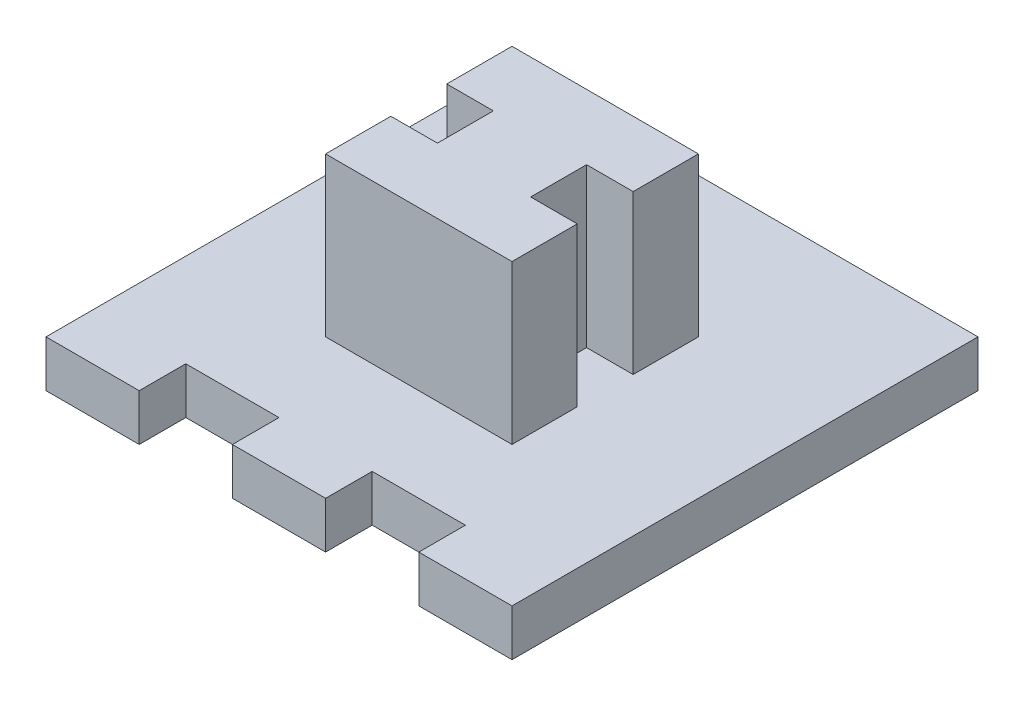
ISO-10303-21;
HEADER;
FILE_DESCRIPTION(('STEP AP214'),'2;1');
FILE_NAME('part.step','',(''),(''),'','','');
FILE_SCHEMA(('AUTOMOTIVE_DESIGN { 1 0 10303 214 1 1 1 1 }'));
ENDSEC;
DATA;
#1=APPLICATION_CONTEXT('core data for automotive mechanical design processes');
#2=APPLICATION_PROTOCOL_DEFINITION('international standard','automotive_design',2000,#1);
#3=PRODUCT_CONTEXT('',#1,'mechanical');
#4=PRODUCT('Part','Part','',(#3));
#5=PRODUCT_RELATED_PRODUCT_CATEGORY('part','',(#4));
#6=PRODUCT_DEFINITION_FORMATION('','',#4);
#7=PRODUCT_DEFINITION_CONTEXT('part definition',#1,'design');
#8=PRODUCT_DEFINITION('design','',#6,#7);
#9=PRODUCT_DEFINITION_SHAPE('','',#8);
#10=(LENGTH_UNIT() NAMED_UNIT(*) SI_UNIT(.MILLI.,.METRE.));
#11=(NAMED_UNIT(*) PLANE_ANGLE_UNIT() SI_UNIT($,.RADIAN.));
#12=(NAMED_UNIT(*) SI_UNIT($,.STERADIAN.) SOLID_ANGLE_UNIT());
#13=UNCERTAINTY_MEASURE_WITH_UNIT(LENGTH_MEASURE(1.E-05),#10,'distance_accuracy_value','');
#14=(GEOMETRIC_REPRESENTATION_CONTEXT(3) GLOBAL_UNCERTAINTY_ASSIGNED_CONTEXT((#13)) GLOBAL_UNIT_ASSIGNED_CONTEXT((#10,
#11,#12)) REPRESENTATION_CONTEXT('',''));
#15=CARTESIAN_POINT('',(0.,0.,0.));
#16=DIRECTION('',(0.,0.,1.));
#17=DIRECTION('',(1.,0.,0.));
#18=AXIS2_PLACEMENT_3D('',#15,#16,#17);
#19=CARTESIAN_POINT('',(-20.,44.,-20.));
#20=DIRECTION('',(1.,0.,0.));
#21=DIRECTION('',(0.,0.,-1.));
#22=AXIS2_PLACEMENT_3D('',#19,#20,#21);
#23=PLANE('',#22);
#24=DIRECTION('',(0.,0.,1.));
#25=VECTOR('',#24,1.);
#26=CARTESIAN_POINT('',(-20.,10.,-20.));
#27=LINE('',#26,#25);
#28=CARTESIAN_POINT('',(-20.,10.,-20.));
#29=VERTEX_POINT('',#28);
#30=CARTESIAN_POINT('',(-20.,10.,-6.));
#31=VERTEX_POINT('',#30);
#32=EDGE_CURVE('E218',#29,#31,#27,.T.);
#33=ORIENTED_EDGE('',*,*,#32,.T.);
#34=DIRECTION('',(0.,1.,0.));
#35=VECTOR('',#34,1.);
#36=CARTESIAN_POINT('',(-20.,10.,-6.));
#37=LINE('',#36,#35);
#38=CARTESIAN_POINT('',(-20.,44.,-6.));
#39=VERTEX_POINT('',#38);
#40=EDGE_CURVE('E390',#31,#39,#37,.T.);
#41=ORIENTED_EDGE('',*,*,#40,.T.);
#42=DIRECTION('',(0.,0.,1.));
#43=VECTOR('',#42,1.);
#44=CARTESIAN_POINT('',(-20.,44.,-20.));
#45=LINE('',#44,#43);
#46=CARTESIAN_POINT('',(-20.,44.,-20.));
#47=VERTEX_POINT('',#46);
#48=EDGE_CURVE('E368',#47,#39,#45,.T.);
#49=ORIENTED_EDGE('',*,*,#48,.F.);
#50=DIRECTION('',(0.,-1.,0.));
#51=VECTOR('',#50,1.);
#52=CARTESIAN_POINT('',(-20.,44.,-20.));
#53=LINE('',#52,#51);
#54=EDGE_CURVE('E234',#47,#29,#53,.T.);
#55=ORIENTED_EDGE('',*,*,#54,.T.);
#56=EDGE_LOOP('',(#33,#41,#49,#55));
#57=FACE_BOUND('',#56,.T.);
#58=ADVANCED_FACE('F33',(#57),#23,.F.);
#59=CARTESIAN_POINT('',(20.,44.,-20.));
#60=DIRECTION('',(-1.,0.,0.));
#61=DIRECTION('',(0.,0.,1.));
#62=AXIS2_PLACEMENT_3D('',#59,#60,#61);
#63=PLANE('',#62);
#64=DIRECTION('',(0.,0.,-1.));
#65=VECTOR('',#64,1.);
#66=CARTESIAN_POINT('',(20.,10.,-20.));
#67=LINE('',#66,#65);
#68=CARTESIAN_POINT('',(20.,10.,20.));
#69=VERTEX_POINT('',#68);
#70=CARTESIAN_POINT('',(20.,10.,6.));
#71=VERTEX_POINT('',#70);
#72=EDGE_CURVE('E222',#69,#71,#67,.T.);
#73=ORIENTED_EDGE('',*,*,#72,.T.);
#74=DIRECTION('',(0.,1.,0.));
#75=VECTOR('',#74,1.);
#76=CARTESIAN_POINT('',(20.,10.,6.));
#77=LINE('',#76,#75);
#78=CARTESIAN_POINT('',(20.,44.,6.));
#79=VERTEX_POINT('',#78);
#80=EDGE_CURVE('E335',#71,#79,#77,.T.);
#81=ORIENTED_EDGE('',*,*,#80,.T.);
#82=DIRECTION('',(0.,0.,-1.));
#83=VECTOR('',#82,1.);
#84=CARTESIAN_POINT('',(20.,44.,-20.));
#85=LINE('',#84,#83);
#86=CARTESIAN_POINT('',(20.,44.,20.));
#87=VERTEX_POINT('',#86);
#88=EDGE_CURVE('E363',#87,#79,#85,.T.);
#89=ORIENTED_EDGE('',*,*,#88,.F.);
#90=DIRECTION('',(0.,-1.,0.));
#91=VECTOR('',#90,1.);
#92=CARTESIAN_POINT('',(20.,44.,20.));
#93=LINE('',#92,#91);
#94=EDGE_CURVE('E228',#87,#69,#93,.T.);
#95=ORIENTED_EDGE('',*,*,#94,.T.);
#96=EDGE_LOOP('',(#73,#81,#89,#95));
#97=FACE_BOUND('',#96,.T.);
#98=ADVANCED_FACE('F440',(#97),#63,.F.);
#99=CARTESIAN_POINT('',(-50.,10.,50.));
#100=DIRECTION('',(0.,0.,-1.));
#101=DIRECTION('',(-1.,0.,0.));
#102=AXIS2_PLACEMENT_3D('',#99,#100,#101);
#103=PLANE('',#102);
#104=DIRECTION('',(1.,0.,0.));
#105=VECTOR('',#104,1.);
#106=CARTESIAN_POINT('',(-50.,0.,50.));
#107=LINE('',#106,#105);
#108=CARTESIAN_POINT('',(-10.,0.,50.));
#109=VERTEX_POINT('',#108);
#110=CARTESIAN_POINT('',(10.,0.,50.));
#111=VERTEX_POINT('',#110);
#112=EDGE_CURVE('E264',#109,#111,#107,.T.);
#113=ORIENTED_EDGE('',*,*,#112,.T.);
#114=DIRECTION('',(0.,1.,0.));
#115=VECTOR('',#114,1.);
#116=CARTESIAN_POINT('',(10.,0.,50.));
#117=LINE('',#116,#115);
#118=CARTESIAN_POINT('',(10.,10.,50.));
#119=VERTEX_POINT('',#118);
#120=EDGE_CURVE('E313',#111,#119,#117,.T.);
#121=ORIENTED_EDGE('',*,*,#120,.T.);
#122=DIRECTION('',(1.,0.,0.));
#123=VECTOR('',#122,1.);
#124=CARTESIAN_POINT('',(-50.,10.,50.));
#125=LINE('',#124,#123);
#126=CARTESIAN_POINT('',(-10.,10.,50.));
#127=VERTEX_POINT('',#126);
#128=EDGE_CURVE('E254',#127,#119,#125,.T.);
#129=ORIENTED_EDGE('',*,*,#128,.F.);
#130=DIRECTION('',(0.,1.,0.));
#131=VECTOR('',#130,1.);
#132=CARTESIAN_POINT('',(-10.,0.,50.));
#133=LINE('',#132,#131);
#134=EDGE_CURVE('E315',#109,#127,#133,.T.);
#135=ORIENTED_EDGE('',*,*,#134,.F.);
#136=EDGE_LOOP('',(#113,#121,#129,#135));
#137=FACE_BOUND('',#136,.T.);
#138=ADVANCED_FACE('F311',(#137),#103,.F.);
#139=CARTESIAN_POINT('',(-50.,0.,50.));
#140=VERTEX_POINT('',#139);
#141=CARTESIAN_POINT('',(-30.,0.,50.));
#142=VERTEX_POINT('',#141);
#143=EDGE_CURVE('E245',#140,#142,#107,.T.);
#144=ORIENTED_EDGE('',*,*,#143,.T.);
#145=DIRECTION('',(0.,1.,0.));
#146=VECTOR('',#145,1.);
#147=CARTESIAN_POINT('',(-30.,0.,50.));
#148=LINE('',#147,#146);
#149=CARTESIAN_POINT('',(-30.,10.,50.));
#150=VERTEX_POINT('',#149);
#151=EDGE_CURVE('E290',#142,#150,#148,.T.);
#152=ORIENTED_EDGE('',*,*,#151,.T.);
#153=CARTESIAN_POINT('',(-50.,10.,50.));
#154=VERTEX_POINT('',#153);
#155=EDGE_CURVE('E250',#154,#150,#125,.T.);
#156=ORIENTED_EDGE('',*,*,#155,.F.);
#157=DIRECTION('',(0.,-1.,0.));
#158=VECTOR('',#157,1.);
#159=CARTESIAN_POINT('',(-50.,10.,50.));
#160=LINE('',#159,#158);
#161=EDGE_CURVE('E267',#154,#140,#160,.T.);
#162=ORIENTED_EDGE('',*,*,#161,.T.);
#163=EDGE_LOOP('',(#144,#152,#156,#162));
#164=FACE_BOUND('',#163,.T.);
#165=ADVANCED_FACE('F288',(#164),#103,.F.);
#166=CARTESIAN_POINT('',(50.,10.,50.));
#167=DIRECTION('',(0.,1.,0.));
#168=DIRECTION('',(0.,0.,1.));
#169=AXIS2_PLACEMENT_3D('',#166,#167,#168);
#170=PLANE('',#169);
#171=DIRECTION('',(0.,0.,1.));
#172=VECTOR('',#171,1.);
#173=CARTESIAN_POINT('',(10.,10.,50.));
#174=LINE('',#173,#172);
#175=CARTESIAN_POINT('',(10.,10.,40.));
#176=VERTEX_POINT('',#175);
#177=EDGE_CURVE('E333',#176,#119,#174,.T.);
#178=ORIENTED_EDGE('',*,*,#177,.F.);
#179=DIRECTION('',(-1.,0.,0.));
#180=VECTOR('',#179,1.);
#181=CARTESIAN_POINT('',(10.,10.,40.));
#182=LINE('',#181,#180);
#183=CARTESIAN_POINT('',(30.,10.,40.));
#184=VERTEX_POINT('',#183);
#185=EDGE_CURVE('E323',#184,#176,#182,.T.);
#186=ORIENTED_EDGE('',*,*,#185,.F.);
#187=DIRECTION('',(0.,0.,-1.));
#188=VECTOR('',#187,1.);
#189=CARTESIAN_POINT('',(30.,10.,50.));
#190=LINE('',#189,#188);
#191=CARTESIAN_POINT('',(30.,10.,50.));
#192=VERTEX_POINT('',#191);
#193=EDGE_CURVE('E327',#192,#184,#190,.T.);
#194=ORIENTED_EDGE('',*,*,#193,.F.);
#195=CARTESIAN_POINT('',(50.,10.,50.));
#196=VERTEX_POINT('',#195);
#197=EDGE_CURVE('E249',#192,#196,#125,.T.);
#198=ORIENTED_EDGE('',*,*,#197,.T.);
#199=DIRECTION('',(0.,0.,-1.));
#200=VECTOR('',#199,1.);
#201=CARTESIAN_POINT('',(50.,10.,-50.));
#202=LINE('',#201,#200);
#203=CARTESIAN_POINT('',(50.,10.,-50.));
#204=VERTEX_POINT('',#203);
#205=EDGE_CURVE('E241',#196,#204,#202,.T.);
#206=ORIENTED_EDGE('',*,*,#205,.T.);
#207=DIRECTION('',(-1.,0.,0.));
#208=VECTOR('',#207,1.);
#209=CARTESIAN_POINT('',(-50.,10.,-50.));
#210=LINE('',#209,#208);
#211=CARTESIAN_POINT('',(-50.,10.,-50.));
#212=VERTEX_POINT('',#211);
#213=EDGE_CURVE('E244',#204,#212,#210,.T.);
#214=ORIENTED_EDGE('',*,*,#213,.T.);
#215=DIRECTION('',(0.,0.,1.));
#216=VECTOR('',#215,1.);
#217=CARTESIAN_POINT('',(-50.,10.,-50.));
#218=LINE('',#217,#216);
#219=EDGE_CURVE('E247',#212,#154,#218,.T.);
#220=ORIENTED_EDGE('',*,*,#219,.T.);
#221=ORIENTED_EDGE('',*,*,#155,.T.);
#222=DIRECTION('',(0.,0.,1.));
#223=VECTOR('',#222,1.);
#224=CARTESIAN_POINT('',(-30.,10.,40.));
#225=LINE('',#224,#223);
#226=CARTESIAN_POINT('',(-30.,10.,40.));
#227=VERTEX_POINT('',#226);
#228=EDGE_CURVE('E295',#227,#150,#225,.T.);
#229=ORIENTED_EDGE('',*,*,#228,.F.);
#230=DIRECTION('',(-1.,0.,0.));
#231=VECTOR('',#230,1.);
#232=CARTESIAN_POINT('',(-30.,10.,40.));
#233=LINE('',#232,#231);
#234=CARTESIAN_POINT('',(-10.,10.,40.));
#235=VERTEX_POINT('',#234);
#236=EDGE_CURVE('E346',#235,#227,#233,.T.);
#237=ORIENTED_EDGE('',*,*,#236,.F.);
#238=DIRECTION('',(0.,0.,-1.));
#239=VECTOR('',#238,1.);
#240=CARTESIAN_POINT('',(-10.,10.,40.));
#241=LINE('',#240,#239);
#242=EDGE_CURVE('E351',#127,#235,#241,.T.);
#243=ORIENTED_EDGE('',*,*,#242,.F.);
#244=ORIENTED_EDGE('',*,*,#128,.T.);
#245=EDGE_LOOP('',(#178,#186,#194,#198,#206,#214,#220,#221,#229,#237,#243,#244));
#246=FACE_BOUND('',#245,.T.);
#247=DIRECTION('',(-1.,0.,0.));
#248=VECTOR('',#247,1.);
#249=CARTESIAN_POINT('',(-20.,10.,-20.));
#250=LINE('',#249,#248);
#251=CARTESIAN_POINT('',(20.,10.,-20.));
#252=VERTEX_POINT('',#251);
#253=EDGE_CURVE('E219',#252,#29,#250,.T.);
#254=ORIENTED_EDGE('',*,*,#253,.F.);
#255=CARTESIAN_POINT('',(20.,10.,-6.));
#256=VERTEX_POINT('',#255);
#257=EDGE_CURVE('E358',#256,#252,#67,.T.);
#258=ORIENTED_EDGE('',*,*,#257,.F.);
#259=DIRECTION('',(-1.,0.,0.));
#260=VECTOR('',#259,1.);
#261=CARTESIAN_POINT('',(20.,10.,-6.));
#262=LINE('',#261,#260);
#263=CARTESIAN_POINT('',(10.,10.,-6.));
#264=VERTEX_POINT('',#263);
#265=EDGE_CURVE('E410',#256,#264,#262,.T.);
#266=ORIENTED_EDGE('',*,*,#265,.T.);
#267=DIRECTION('',(0.,0.,1.));
#268=VECTOR('',#267,1.);
#269=CARTESIAN_POINT('',(10.,10.,-6.));
#270=LINE('',#269,#268);
#271=CARTESIAN_POINT('',(10.,10.,6.));
#272=VERTEX_POINT('',#271);
#273=EDGE_CURVE('E417',#264,#272,#270,.T.);
#274=ORIENTED_EDGE('',*,*,#273,.T.);
#275=DIRECTION('',(1.,0.,0.));
#276=VECTOR('',#275,1.);
#277=CARTESIAN_POINT('',(20.,10.,6.));
#278=LINE('',#277,#276);
#279=EDGE_CURVE('E406',#272,#71,#278,.T.);
#280=ORIENTED_EDGE('',*,*,#279,.T.);
#281=ORIENTED_EDGE('',*,*,#72,.F.);
#282=DIRECTION('',(1.,0.,0.));
#283=VECTOR('',#282,1.);
#284=CARTESIAN_POINT('',(-20.,10.,20.));
#285=LINE('',#284,#283);
#286=CARTESIAN_POINT('',(-20.,10.,20.));
#287=VERTEX_POINT('',#286);
#288=EDGE_CURVE('E217',#287,#69,#285,.T.);
#289=ORIENTED_EDGE('',*,*,#288,.F.);
#290=CARTESIAN_POINT('',(-20.,10.,6.));
#291=VERTEX_POINT('',#290);
#292=EDGE_CURVE('E208',#291,#287,#27,.T.);
#293=ORIENTED_EDGE('',*,*,#292,.F.);
#294=DIRECTION('',(1.,0.,0.));
#295=VECTOR('',#294,1.);
#296=CARTESIAN_POINT('',(-20.,10.,6.));
#297=LINE('',#296,#295);
#298=CARTESIAN_POINT('',(-10.,10.,6.));
#299=VERTEX_POINT('',#298);
#300=EDGE_CURVE('E194',#291,#299,#297,.T.);
#301=ORIENTED_EDGE('',*,*,#300,.T.);
#302=DIRECTION('',(0.,0.,-1.));
#303=VECTOR('',#302,1.);
#304=CARTESIAN_POINT('',(-10.,10.,-6.));
#305=LINE('',#304,#303);
#306=CARTESIAN_POINT('',(-10.,10.,-6.));
#307=VERTEX_POINT('',#306);
#308=EDGE_CURVE('E201',#299,#307,#305,.T.);
#309=ORIENTED_EDGE('',*,*,#308,.T.);
#310=DIRECTION('',(-1.,0.,0.));
#311=VECTOR('',#310,1.);
#312=CARTESIAN_POINT('',(-20.,10.,-6.));
#313=LINE('',#312,#311);
#314=EDGE_CURVE('E211',#307,#31,#313,.T.);
#315=ORIENTED_EDGE('',*,*,#314,.T.);
#316=ORIENTED_EDGE('',*,*,#32,.F.);
#317=EDGE_LOOP('',(#254,#258,#266,#274,#280,#281,#289,#293,#301,#309,#315,#316));
#318=FACE_BOUND('',#317,.T.);
#319=ADVANCED_FACE('F215',(#246,#318),#170,.T.);
#320=CARTESIAN_POINT('',(50.,10.,-50.));
#321=DIRECTION('',(-1.,0.,0.));
#322=DIRECTION('',(0.,0.,1.));
#323=AXIS2_PLACEMENT_3D('',#320,#321,#322);
#324=PLANE('',#323);
#325=DIRECTION('',(0.,0.,-1.));
#326=VECTOR('',#325,1.);
#327=CARTESIAN_POINT('',(50.,0.,-50.));
#328=LINE('',#327,#326);
#329=CARTESIAN_POINT('',(50.,0.,50.));
#330=VERTEX_POINT('',#329);
#331=CARTESIAN_POINT('',(50.,0.,-50.));
#332=VERTEX_POINT('',#331);
#333=EDGE_CURVE('E240',#330,#332,#328,.T.);
#334=ORIENTED_EDGE('',*,*,#333,.T.);
#335=DIRECTION('',(0.,-1.,0.));
#336=VECTOR('',#335,1.);
#337=CARTESIAN_POINT('',(50.,10.,-50.));
#338=LINE('',#337,#336);
#339=EDGE_CURVE('E11',#204,#332,#338,.T.);
#340=ORIENTED_EDGE('',*,*,#339,.F.);
#341=ORIENTED_EDGE('',*,*,#205,.F.);
#342=DIRECTION('',(0.,-1.,0.));
#343=VECTOR('',#342,1.);
#344=CARTESIAN_POINT('',(50.,10.,50.));
#345=LINE('',#344,#343);
#346=EDGE_CURVE('E253',#196,#330,#345,.T.);
#347=ORIENTED_EDGE('',*,*,#346,.T.);
#348=EDGE_LOOP('',(#334,#340,#341,#347));
#349=FACE_BOUND('',#348,.T.);
#350=ADVANCED_FACE('F35',(#349),#324,.F.);
#351=CARTESIAN_POINT('',(-50.,10.,-50.));
#352=DIRECTION('',(0.,0.,1.));
#353=DIRECTION('',(1.,0.,0.));
#354=AXIS2_PLACEMENT_3D('',#351,#352,#353);
#355=PLANE('',#354);
#356=DIRECTION('',(-1.,0.,0.));
#357=VECTOR('',#356,1.);
#358=CARTESIAN_POINT('',(-50.,0.,-50.));
#359=LINE('',#358,#357);
#360=CARTESIAN_POINT('',(-50.,0.,-50.));
#361=VERTEX_POINT('',#360);
#362=EDGE_CURVE('E257',#332,#361,#359,.T.);
#363=ORIENTED_EDGE('',*,*,#362,.T.);
#364=DIRECTION('',(0.,-1.,0.));
#365=VECTOR('',#364,1.);
#366=CARTESIAN_POINT('',(-50.,10.,-50.));
#367=LINE('',#366,#365);
#368=EDGE_CURVE('E41',#212,#361,#367,.T.);
#369=ORIENTED_EDGE('',*,*,#368,.F.);
#370=ORIENTED_EDGE('',*,*,#213,.F.);
#371=ORIENTED_EDGE('',*,*,#339,.T.);
#372=EDGE_LOOP('',(#363,#369,#370,#371));
#373=FACE_BOUND('',#372,.T.);
#374=ADVANCED_FACE('F298',(#373),#355,.F.);
#375=CARTESIAN_POINT('',(-50.,10.,-50.));
#376=DIRECTION('',(1.,0.,0.));
#377=DIRECTION('',(0.,0.,-1.));
#378=AXIS2_PLACEMENT_3D('',#375,#376,#377);
#379=PLANE('',#378);
#380=DIRECTION('',(0.,0.,1.));
#381=VECTOR('',#380,1.);
#382=CARTESIAN_POINT('',(-50.,0.,-50.));
#383=LINE('',#382,#381);
#384=EDGE_CURVE('E259',#361,#140,#383,.T.);
#385=ORIENTED_EDGE('',*,*,#384,.T.);
#386=ORIENTED_EDGE('',*,*,#161,.F.);
#387=ORIENTED_EDGE('',*,*,#219,.F.);
#388=ORIENTED_EDGE('',*,*,#368,.T.);
#389=EDGE_LOOP('',(#385,#386,#387,#388));
#390=FACE_BOUND('',#389,.T.);
#391=ADVANCED_FACE('F274',(#390),#379,.F.);
#392=ORIENTED_EDGE('',*,*,#197,.F.);
#393=DIRECTION('',(0.,1.,0.));
#394=VECTOR('',#393,1.);
#395=CARTESIAN_POINT('',(30.,0.,50.));
#396=LINE('',#395,#394);
#397=CARTESIAN_POINT('',(30.,0.,50.));
#398=VERTEX_POINT('',#397);
#399=EDGE_CURVE('E342',#398,#192,#396,.T.);
#400=ORIENTED_EDGE('',*,*,#399,.F.);
#401=EDGE_CURVE('E261',#398,#330,#107,.T.);
#402=ORIENTED_EDGE('',*,*,#401,.T.);
#403=ORIENTED_EDGE('',*,*,#346,.F.);
#404=EDGE_LOOP('',(#392,#400,#402,#403));
#405=FACE_BOUND('',#404,.T.);
#406=ADVANCED_FACE('F478',(#405),#103,.F.);
#407=CARTESIAN_POINT('',(50.,0.,50.));
#408=DIRECTION('',(0.,1.,0.));
#409=DIRECTION('',(0.,0.,1.));
#410=AXIS2_PLACEMENT_3D('',#407,#408,#409);
#411=PLANE('',#410);
#412=DIRECTION('',(-1.,0.,0.));
#413=VECTOR('',#412,1.);
#414=CARTESIAN_POINT('',(10.,0.,40.));
#415=LINE('',#414,#413);
#416=CARTESIAN_POINT('',(30.,0.,40.));
#417=VERTEX_POINT('',#416);
#418=CARTESIAN_POINT('',(10.,0.,40.));
#419=VERTEX_POINT('',#418);
#420=EDGE_CURVE('E321',#417,#419,#415,.T.);
#421=ORIENTED_EDGE('',*,*,#420,.T.);
#422=DIRECTION('',(0.,0.,1.));
#423=VECTOR('',#422,1.);
#424=CARTESIAN_POINT('',(10.,0.,50.));
#425=LINE('',#424,#423);
#426=EDGE_CURVE('E320',#419,#111,#425,.T.);
#427=ORIENTED_EDGE('',*,*,#426,.T.);
#428=ORIENTED_EDGE('',*,*,#112,.F.);
#429=DIRECTION('',(0.,0.,-1.));
#430=VECTOR('',#429,1.);
#431=CARTESIAN_POINT('',(-10.,0.,40.));
#432=LINE('',#431,#430);
#433=CARTESIAN_POINT('',(-10.,0.,40.));
#434=VERTEX_POINT('',#433);
#435=EDGE_CURVE('E318',#109,#434,#432,.T.);
#436=ORIENTED_EDGE('',*,*,#435,.T.);
#437=DIRECTION('',(-1.,0.,0.));
#438=VECTOR('',#437,1.);
#439=CARTESIAN_POINT('',(-30.,0.,40.));
#440=LINE('',#439,#438);
#441=CARTESIAN_POINT('',(-30.,0.,40.));
#442=VERTEX_POINT('',#441);
#443=EDGE_CURVE('E348',#434,#442,#440,.T.);
#444=ORIENTED_EDGE('',*,*,#443,.T.);
#445=DIRECTION('',(0.,0.,1.));
#446=VECTOR('',#445,1.);
#447=CARTESIAN_POINT('',(-30.,0.,40.));
#448=LINE('',#447,#446);
#449=EDGE_CURVE('E285',#442,#142,#448,.T.);
#450=ORIENTED_EDGE('',*,*,#449,.T.);
#451=ORIENTED_EDGE('',*,*,#143,.F.);
#452=ORIENTED_EDGE('',*,*,#384,.F.);
#453=ORIENTED_EDGE('',*,*,#362,.F.);
#454=ORIENTED_EDGE('',*,*,#333,.F.);
#455=ORIENTED_EDGE('',*,*,#401,.F.);
#456=DIRECTION('',(0.,0.,-1.));
#457=VECTOR('',#456,1.);
#458=CARTESIAN_POINT('',(30.,0.,50.));
#459=LINE('',#458,#457);
#460=EDGE_CURVE('E303',#398,#417,#459,.T.);
#461=ORIENTED_EDGE('',*,*,#460,.T.);
#462=EDGE_LOOP('',(#421,#427,#428,#436,#444,#450,#451,#452,#453,#454,#455,#461));
#463=FACE_BOUND('',#462,.T.);
#464=ADVANCED_FACE('F280',(#463),#411,.F.);
#465=CARTESIAN_POINT('',(20.,44.,-6.));
#466=VERTEX_POINT('',#465);
#467=CARTESIAN_POINT('',(20.,44.,-20.));
#468=VERTEX_POINT('',#467);
#469=EDGE_CURVE('E227',#466,#468,#85,.T.);
#470=ORIENTED_EDGE('',*,*,#469,.F.);
#471=DIRECTION('',(0.,1.,0.));
#472=VECTOR('',#471,1.);
#473=CARTESIAN_POINT('',(20.,10.,-6.));
#474=LINE('',#473,#472);
#475=EDGE_CURVE('E56',#256,#466,#474,.T.);
#476=ORIENTED_EDGE('',*,*,#475,.F.);
#477=ORIENTED_EDGE('',*,*,#257,.T.);
#478=DIRECTION('',(0.,-1.,0.));
#479=VECTOR('',#478,1.);
#480=CARTESIAN_POINT('',(20.,44.,-20.));
#481=LINE('',#480,#479);
#482=EDGE_CURVE('E237',#468,#252,#481,.T.);
#483=ORIENTED_EDGE('',*,*,#482,.F.);
#484=EDGE_LOOP('',(#470,#476,#477,#483));
#485=FACE_BOUND('',#484,.T.);
#486=ADVANCED_FACE('F378',(#485),#63,.F.);
#487=CARTESIAN_POINT('',(-20.,44.,-20.));
#488=DIRECTION('',(0.,0.,1.));
#489=DIRECTION('',(1.,0.,0.));
#490=AXIS2_PLACEMENT_3D('',#487,#488,#489);
#491=PLANE('',#490);
#492=ORIENTED_EDGE('',*,*,#253,.T.);
#493=ORIENTED_EDGE('',*,*,#54,.F.);
#494=DIRECTION('',(-1.,0.,0.));
#495=VECTOR('',#494,1.);
#496=CARTESIAN_POINT('',(-20.,44.,-20.));
#497=LINE('',#496,#495);
#498=EDGE_CURVE('E366',#468,#47,#497,.T.);
#499=ORIENTED_EDGE('',*,*,#498,.F.);
#500=ORIENTED_EDGE('',*,*,#482,.T.);
#501=EDGE_LOOP('',(#492,#493,#499,#500));
#502=FACE_BOUND('',#501,.T.);
#503=ADVANCED_FACE('F382',(#502),#491,.F.);
#504=CARTESIAN_POINT('',(-20.,44.,6.));
#505=VERTEX_POINT('',#504);
#506=CARTESIAN_POINT('',(-20.,44.,20.));
#507=VERTEX_POINT('',#506);
#508=EDGE_CURVE('E210',#505,#507,#45,.T.);
#509=ORIENTED_EDGE('',*,*,#508,.F.);
#510=DIRECTION('',(0.,1.,0.));
#511=VECTOR('',#510,1.);
#512=CARTESIAN_POINT('',(-20.,10.,6.));
#513=LINE('',#512,#511);
#514=EDGE_CURVE('E48',#291,#505,#513,.T.);
#515=ORIENTED_EDGE('',*,*,#514,.F.);
#516=ORIENTED_EDGE('',*,*,#292,.T.);
#517=DIRECTION('',(0.,-1.,0.));
#518=VECTOR('',#517,1.);
#519=CARTESIAN_POINT('',(-20.,44.,20.));
#520=LINE('',#519,#518);
#521=EDGE_CURVE('E231',#507,#287,#520,.T.);
#522=ORIENTED_EDGE('',*,*,#521,.F.);
#523=EDGE_LOOP('',(#509,#515,#516,#522));
#524=FACE_BOUND('',#523,.T.);
#525=ADVANCED_FACE('F206',(#524),#23,.F.);
#526=CARTESIAN_POINT('',(-20.,44.,20.));
#527=DIRECTION('',(0.,0.,-1.));
#528=DIRECTION('',(-1.,0.,0.));
#529=AXIS2_PLACEMENT_3D('',#526,#527,#528);
#530=PLANE('',#529);
#531=ORIENTED_EDGE('',*,*,#288,.T.);
#532=ORIENTED_EDGE('',*,*,#94,.F.);
#533=DIRECTION('',(1.,0.,0.));
#534=VECTOR('',#533,1.);
#535=CARTESIAN_POINT('',(-20.,44.,20.));
#536=LINE('',#535,#534);
#537=EDGE_CURVE('E232',#507,#87,#536,.T.);
#538=ORIENTED_EDGE('',*,*,#537,.F.);
#539=ORIENTED_EDGE('',*,*,#521,.T.);
#540=EDGE_LOOP('',(#531,#532,#538,#539));
#541=FACE_BOUND('',#540,.T.);
#542=ADVANCED_FACE('F438',(#541),#530,.F.);
#543=CARTESIAN_POINT('',(20.,44.,20.));
#544=DIRECTION('',(0.,1.,0.));
#545=DIRECTION('',(0.,0.,1.));
#546=AXIS2_PLACEMENT_3D('',#543,#544,#545);
#547=PLANE('',#546);
#548=DIRECTION('',(-1.,0.,0.));
#549=VECTOR('',#548,1.);
#550=CARTESIAN_POINT('',(-20.,44.,-6.));
#551=LINE('',#550,#549);
#552=CARTESIAN_POINT('',(-10.,44.,-6.));
#553=VERTEX_POINT('',#552);
#554=EDGE_CURVE('E202',#553,#39,#551,.T.);
#555=ORIENTED_EDGE('',*,*,#554,.F.);
#556=DIRECTION('',(0.,0.,-1.));
#557=VECTOR('',#556,1.);
#558=CARTESIAN_POINT('',(-10.,44.,-6.));
#559=LINE('',#558,#557);
#560=CARTESIAN_POINT('',(-10.,44.,6.));
#561=VERTEX_POINT('',#560);
#562=EDGE_CURVE('E425',#561,#553,#559,.T.);
#563=ORIENTED_EDGE('',*,*,#562,.F.);
#564=DIRECTION('',(1.,0.,0.));
#565=VECTOR('',#564,1.);
#566=CARTESIAN_POINT('',(-20.,44.,6.));
#567=LINE('',#566,#565);
#568=EDGE_CURVE('E428',#505,#561,#567,.T.);
#569=ORIENTED_EDGE('',*,*,#568,.F.);
#570=ORIENTED_EDGE('',*,*,#508,.T.);
#571=ORIENTED_EDGE('',*,*,#537,.T.);
#572=ORIENTED_EDGE('',*,*,#88,.T.);
#573=DIRECTION('',(1.,0.,0.));
#574=VECTOR('',#573,1.);
#575=CARTESIAN_POINT('',(20.,44.,6.));
#576=LINE('',#575,#574);
#577=CARTESIAN_POINT('',(10.,44.,6.));
#578=VERTEX_POINT('',#577);
#579=EDGE_CURVE('E401',#578,#79,#576,.T.);
#580=ORIENTED_EDGE('',*,*,#579,.F.);
#581=DIRECTION('',(0.,0.,1.));
#582=VECTOR('',#581,1.);
#583=CARTESIAN_POINT('',(10.,44.,-6.));
#584=LINE('',#583,#582);
#585=CARTESIAN_POINT('',(10.,44.,-6.));
#586=VERTEX_POINT('',#585);
#587=EDGE_CURVE('E399',#586,#578,#584,.T.);
#588=ORIENTED_EDGE('',*,*,#587,.F.);
#589=DIRECTION('',(-1.,0.,0.));
#590=VECTOR('',#589,1.);
#591=CARTESIAN_POINT('',(20.,44.,-6.));
#592=LINE('',#591,#590);
#593=EDGE_CURVE('E396',#466,#586,#592,.T.);
#594=ORIENTED_EDGE('',*,*,#593,.F.);
#595=ORIENTED_EDGE('',*,*,#469,.T.);
#596=ORIENTED_EDGE('',*,*,#498,.T.);
#597=ORIENTED_EDGE('',*,*,#48,.T.);
#598=EDGE_LOOP('',(#555,#563,#569,#570,#571,#572,#580,#588,#594,#595,#596,#597));
#599=FACE_BOUND('',#598,.T.);
#600=ADVANCED_FACE('F393',(#599),#547,.T.);
#601=CARTESIAN_POINT('',(-30.,0.,40.));
#602=DIRECTION('',(-1.,0.,0.));
#603=DIRECTION('',(0.,0.,1.));
#604=AXIS2_PLACEMENT_3D('',#601,#602,#603);
#605=PLANE('',#604);
#606=ORIENTED_EDGE('',*,*,#228,.T.);
#607=ORIENTED_EDGE('',*,*,#151,.F.);
#608=ORIENTED_EDGE('',*,*,#449,.F.);
#609=DIRECTION('',(0.,1.,0.));
#610=VECTOR('',#609,1.);
#611=CARTESIAN_POINT('',(-30.,0.,40.));
#612=LINE('',#611,#610);
#613=EDGE_CURVE('E356',#442,#227,#612,.T.);
#614=ORIENTED_EDGE('',*,*,#613,.T.);
#615=EDGE_LOOP('',(#606,#607,#608,#614));
#616=FACE_BOUND('',#615,.T.);
#617=ADVANCED_FACE('F606',(#616),#605,.F.);
#618=CARTESIAN_POINT('',(-30.,0.,40.));
#619=DIRECTION('',(0.,0.,-1.));
#620=DIRECTION('',(-1.,0.,0.));
#621=AXIS2_PLACEMENT_3D('',#618,#619,#620);
#622=PLANE('',#621);
#623=ORIENTED_EDGE('',*,*,#236,.T.);
#624=ORIENTED_EDGE('',*,*,#613,.F.);
#625=ORIENTED_EDGE('',*,*,#443,.F.);
#626=DIRECTION('',(0.,1.,0.));
#627=VECTOR('',#626,1.);
#628=CARTESIAN_POINT('',(-10.,0.,40.));
#629=LINE('',#628,#627);
#630=EDGE_CURVE('E359',#434,#235,#629,.T.);
#631=ORIENTED_EDGE('',*,*,#630,.T.);
#632=EDGE_LOOP('',(#623,#624,#625,#631));
#633=FACE_BOUND('',#632,.T.);
#634=ADVANCED_FACE('F617',(#633),#622,.F.);
#635=CARTESIAN_POINT('',(-10.,0.,40.));
#636=DIRECTION('',(1.,0.,0.));
#637=DIRECTION('',(0.,0.,-1.));
#638=AXIS2_PLACEMENT_3D('',#635,#636,#637);
#639=PLANE('',#638);
#640=ORIENTED_EDGE('',*,*,#242,.T.);
#641=ORIENTED_EDGE('',*,*,#630,.F.);
#642=ORIENTED_EDGE('',*,*,#435,.F.);
#643=ORIENTED_EDGE('',*,*,#134,.T.);
#644=EDGE_LOOP('',(#640,#641,#642,#643));
#645=FACE_BOUND('',#644,.T.);
#646=ADVANCED_FACE('F508',(#645),#639,.F.);
#647=CARTESIAN_POINT('',(10.,0.,50.));
#648=DIRECTION('',(-1.,0.,0.));
#649=DIRECTION('',(0.,0.,1.));
#650=AXIS2_PLACEMENT_3D('',#647,#648,#649);
#651=PLANE('',#650);
#652=ORIENTED_EDGE('',*,*,#177,.T.);
#653=ORIENTED_EDGE('',*,*,#120,.F.);
#654=ORIENTED_EDGE('',*,*,#426,.F.);
#655=DIRECTION('',(0.,1.,0.));
#656=VECTOR('',#655,1.);
#657=CARTESIAN_POINT('',(10.,0.,40.));
#658=LINE('',#657,#656);
#659=EDGE_CURVE('E338',#419,#176,#658,.T.);
#660=ORIENTED_EDGE('',*,*,#659,.T.);
#661=EDGE_LOOP('',(#652,#653,#654,#660));
#662=FACE_BOUND('',#661,.T.);
#663=ADVANCED_FACE('F526',(#662),#651,.F.);
#664=CARTESIAN_POINT('',(10.,0.,40.));
#665=DIRECTION('',(0.,0.,-1.));
#666=DIRECTION('',(-1.,0.,0.));
#667=AXIS2_PLACEMENT_3D('',#664,#665,#666);
#668=PLANE('',#667);
#669=ORIENTED_EDGE('',*,*,#185,.T.);
#670=ORIENTED_EDGE('',*,*,#659,.F.);
#671=ORIENTED_EDGE('',*,*,#420,.F.);
#672=DIRECTION('',(0.,1.,0.));
#673=VECTOR('',#672,1.);
#674=CARTESIAN_POINT('',(30.,0.,40.));
#675=LINE('',#674,#673);
#676=EDGE_CURVE('E340',#417,#184,#675,.T.);
#677=ORIENTED_EDGE('',*,*,#676,.T.);
#678=EDGE_LOOP('',(#669,#670,#671,#677));
#679=FACE_BOUND('',#678,.T.);
#680=ADVANCED_FACE('F530',(#679),#668,.F.);
#681=CARTESIAN_POINT('',(30.,0.,50.));
#682=DIRECTION('',(1.,0.,0.));
#683=DIRECTION('',(0.,0.,-1.));
#684=AXIS2_PLACEMENT_3D('',#681,#682,#683);
#685=PLANE('',#684);
#686=ORIENTED_EDGE('',*,*,#193,.T.);
#687=ORIENTED_EDGE('',*,*,#676,.F.);
#688=ORIENTED_EDGE('',*,*,#460,.F.);
#689=ORIENTED_EDGE('',*,*,#399,.T.);
#690=EDGE_LOOP('',(#686,#687,#688,#689));
#691=FACE_BOUND('',#690,.T.);
#692=ADVANCED_FACE('F452',(#691),#685,.F.);
#693=CARTESIAN_POINT('',(20.,10.,6.));
#694=DIRECTION('',(0.,0.,1.));
#695=DIRECTION('',(1.,0.,0.));
#696=AXIS2_PLACEMENT_3D('',#693,#694,#695);
#697=PLANE('',#696);
#698=ORIENTED_EDGE('',*,*,#579,.T.);
#699=ORIENTED_EDGE('',*,*,#80,.F.);
#700=ORIENTED_EDGE('',*,*,#279,.F.);
#701=DIRECTION('',(0.,1.,0.));
#702=VECTOR('',#701,1.);
#703=CARTESIAN_POINT('',(10.,10.,6.));
#704=LINE('',#703,#702);
#705=EDGE_CURVE('E412',#272,#578,#704,.T.);
#706=ORIENTED_EDGE('',*,*,#705,.T.);
#707=EDGE_LOOP('',(#698,#699,#700,#706));
#708=FACE_BOUND('',#707,.T.);
#709=ADVANCED_FACE('F442',(#708),#697,.F.);
#710=CARTESIAN_POINT('',(10.,10.,-6.));
#711=DIRECTION('',(-1.,0.,0.));
#712=DIRECTION('',(0.,0.,1.));
#713=AXIS2_PLACEMENT_3D('',#710,#711,#712);
#714=PLANE('',#713);
#715=ORIENTED_EDGE('',*,*,#587,.T.);
#716=ORIENTED_EDGE('',*,*,#705,.F.);
#717=ORIENTED_EDGE('',*,*,#273,.F.);
#718=DIRECTION('',(0.,1.,0.));
#719=VECTOR('',#718,1.);
#720=CARTESIAN_POINT('',(10.,10.,-6.));
#721=LINE('',#720,#719);
#722=EDGE_CURVE('E413',#264,#586,#721,.T.);
#723=ORIENTED_EDGE('',*,*,#722,.T.);
#724=EDGE_LOOP('',(#715,#716,#717,#723));
#725=FACE_BOUND('',#724,.T.);
#726=ADVANCED_FACE('F443',(#725),#714,.F.);
#727=CARTESIAN_POINT('',(20.,10.,-6.));
#728=DIRECTION('',(0.,0.,-1.));
#729=DIRECTION('',(-1.,0.,0.));
#730=AXIS2_PLACEMENT_3D('',#727,#728,#729);
#731=PLANE('',#730);
#732=ORIENTED_EDGE('',*,*,#593,.T.);
#733=ORIENTED_EDGE('',*,*,#722,.F.);
#734=ORIENTED_EDGE('',*,*,#265,.F.);
#735=ORIENTED_EDGE('',*,*,#475,.T.);
#736=EDGE_LOOP('',(#732,#733,#734,#735));
#737=FACE_BOUND('',#736,.T.);
#738=ADVANCED_FACE('F445',(#737),#731,.F.);
#739=CARTESIAN_POINT('',(-20.,10.,-6.));
#740=DIRECTION('',(0.,0.,-1.));
#741=DIRECTION('',(-1.,0.,0.));
#742=AXIS2_PLACEMENT_3D('',#739,#740,#741);
#743=PLANE('',#742);
#744=ORIENTED_EDGE('',*,*,#554,.T.);
#745=ORIENTED_EDGE('',*,*,#40,.F.);
#746=ORIENTED_EDGE('',*,*,#314,.F.);
#747=DIRECTION('',(0.,1.,0.));
#748=VECTOR('',#747,1.);
#749=CARTESIAN_POINT('',(-10.,10.,-6.));
#750=LINE('',#749,#748);
#751=EDGE_CURVE('E403',#307,#553,#750,.T.);
#752=ORIENTED_EDGE('',*,*,#751,.T.);
#753=EDGE_LOOP('',(#744,#745,#746,#752));
#754=FACE_BOUND('',#753,.T.);
#755=ADVANCED_FACE('F433',(#754),#743,.F.);
#756=CARTESIAN_POINT('',(-10.,10.,-6.));
#757=DIRECTION('',(1.,0.,0.));
#758=DIRECTION('',(0.,0.,-1.));
#759=AXIS2_PLACEMENT_3D('',#756,#757,#758);
#760=PLANE('',#759);
#761=ORIENTED_EDGE('',*,*,#562,.T.);
#762=ORIENTED_EDGE('',*,*,#751,.F.);
#763=ORIENTED_EDGE('',*,*,#308,.F.);
#764=DIRECTION('',(0.,1.,0.));
#765=VECTOR('',#764,1.);
#766=CARTESIAN_POINT('',(-10.,10.,6.));
#767=LINE('',#766,#765);
#768=EDGE_CURVE('E196',#299,#561,#767,.T.);
#769=ORIENTED_EDGE('',*,*,#768,.T.);
#770=EDGE_LOOP('',(#761,#762,#763,#769));
#771=FACE_BOUND('',#770,.T.);
#772=ADVANCED_FACE('F434',(#771),#760,.F.);
#773=CARTESIAN_POINT('',(-20.,10.,6.));
#774=DIRECTION('',(0.,0.,1.));
#775=DIRECTION('',(1.,0.,0.));
#776=AXIS2_PLACEMENT_3D('',#773,#774,#775);
#777=PLANE('',#776);
#778=ORIENTED_EDGE('',*,*,#568,.T.);
#779=ORIENTED_EDGE('',*,*,#768,.F.);
#780=ORIENTED_EDGE('',*,*,#300,.F.);
#781=ORIENTED_EDGE('',*,*,#514,.T.);
#782=EDGE_LOOP('',(#778,#779,#780,#781));
#783=FACE_BOUND('',#782,.T.);
#784=ADVANCED_FACE('F195',(#783),#777,.F.);
#785=CLOSED_SHELL('',(#58,#98,#138,#165,#319,#350,#374,#391,#406,#464,#486,#503,#525,#542,#600,
#617,#634,#646,#663,#680,#692,#709,#726,#738,#755,#772,#784));
#786=MANIFOLD_SOLID_BREP('B2',#785);
#787=ADVANCED_BREP_SHAPE_REPRESENTATION('',(#18,#786),#14);
#788=SHAPE_DEFINITION_REPRESENTATION(#9,#787);
ENDSEC;
END-ISO-10303-21;
